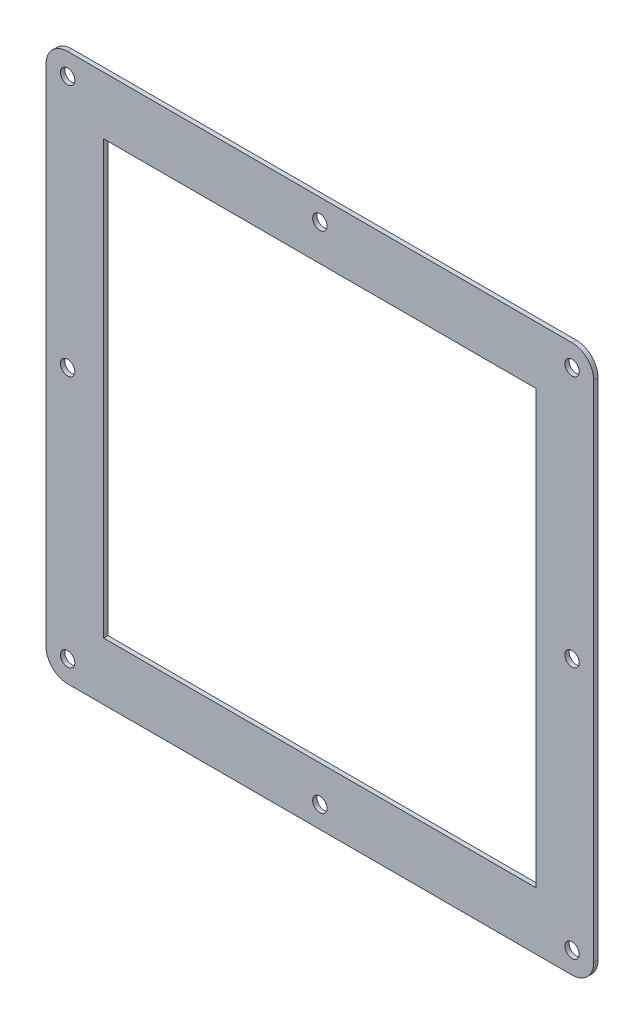
ISO-10303-21;
HEADER;
FILE_DESCRIPTION(('STEP AP214'),'2;1');
FILE_NAME('part.step','',(''),(''),'','','');
FILE_SCHEMA(('AUTOMOTIVE_DESIGN { 1 0 10303 214 1 1 1 1 }'));
ENDSEC;
DATA;
#1=APPLICATION_CONTEXT('core data for automotive mechanical design processes');
#2=APPLICATION_PROTOCOL_DEFINITION('international standard','automotive_design',2000,#1);
#3=PRODUCT_CONTEXT('',#1,'mechanical');
#4=PRODUCT('Part','Part','',(#3));
#5=PRODUCT_RELATED_PRODUCT_CATEGORY('part','',(#4));
#6=PRODUCT_DEFINITION_FORMATION('','',#4);
#7=PRODUCT_DEFINITION_CONTEXT('part definition',#1,'design');
#8=PRODUCT_DEFINITION('design','',#6,#7);
#9=PRODUCT_DEFINITION_SHAPE('','',#8);
#10=(LENGTH_UNIT() NAMED_UNIT(*) SI_UNIT(.MILLI.,.METRE.));
#11=(NAMED_UNIT(*) PLANE_ANGLE_UNIT() SI_UNIT($,.RADIAN.));
#12=(NAMED_UNIT(*) SI_UNIT($,.STERADIAN.) SOLID_ANGLE_UNIT());
#13=UNCERTAINTY_MEASURE_WITH_UNIT(LENGTH_MEASURE(1.E-05),#10,'distance_accuracy_value','');
#14=(GEOMETRIC_REPRESENTATION_CONTEXT(3) GLOBAL_UNCERTAINTY_ASSIGNED_CONTEXT((#13)) GLOBAL_UNIT_ASSIGNED_CONTEXT((#10,
#11,#12)) REPRESENTATION_CONTEXT('',''));
#15=CARTESIAN_POINT('',(0.,0.,0.));
#16=DIRECTION('',(0.,0.,1.));
#17=DIRECTION('',(1.,0.,0.));
#18=AXIS2_PLACEMENT_3D('',#15,#16,#17);
#19=CARTESIAN_POINT('',(-175.,-175.,3.));
#20=DIRECTION('',(0.,0.,1.));
#21=DIRECTION('',(1.,0.,0.));
#22=AXIS2_PLACEMENT_3D('',#19,#20,#21);
#23=PLANE('',#22);
#24=CARTESIAN_POINT('',(0.,-175.,3.));
#25=DIRECTION('',(0.,0.,1.));
#26=DIRECTION('',(1.,0.,0.));
#27=AXIS2_PLACEMENT_3D('',#24,#25,#26);
#28=CIRCLE('',#27,5.);
#29=CARTESIAN_POINT('',(5.,-175.,3.));
#30=VERTEX_POINT('',#29);
#31=EDGE_CURVE('E372',#30,#30,#28,.T.);
#32=ORIENTED_EDGE('',*,*,#31,.F.);
#33=EDGE_LOOP('',(#32));
#34=FACE_BOUND('',#33,.T.);
#35=DIRECTION('',(-1.,0.,0.));
#36=VECTOR('',#35,1.);
#37=CARTESIAN_POINT('',(-150.,150.,3.));
#38=LINE('',#37,#36);
#39=CARTESIAN_POINT('',(150.,150.,3.));
#40=VERTEX_POINT('',#39);
#41=CARTESIAN_POINT('',(-150.,150.,3.));
#42=VERTEX_POINT('',#41);
#43=EDGE_CURVE('E130',#40,#42,#38,.T.);
#44=ORIENTED_EDGE('',*,*,#43,.F.);
#45=DIRECTION('',(0.,1.,0.));
#46=VECTOR('',#45,1.);
#47=CARTESIAN_POINT('',(150.,150.,3.));
#48=LINE('',#47,#46);
#49=CARTESIAN_POINT('',(150.,-150.,3.));
#50=VERTEX_POINT('',#49);
#51=EDGE_CURVE('E122',#50,#40,#48,.T.);
#52=ORIENTED_EDGE('',*,*,#51,.F.);
#53=DIRECTION('',(1.,0.,0.));
#54=VECTOR('',#53,1.);
#55=CARTESIAN_POINT('',(-150.,-150.,3.));
#56=LINE('',#55,#54);
#57=CARTESIAN_POINT('',(-150.,-150.,3.));
#58=VERTEX_POINT('',#57);
#59=EDGE_CURVE('E145',#58,#50,#56,.T.);
#60=ORIENTED_EDGE('',*,*,#59,.F.);
#61=DIRECTION('',(0.,-1.,0.));
#62=VECTOR('',#61,1.);
#63=CARTESIAN_POINT('',(-150.,150.,3.));
#64=LINE('',#63,#62);
#65=EDGE_CURVE('E143',#42,#58,#64,.T.);
#66=ORIENTED_EDGE('',*,*,#65,.F.);
#67=EDGE_LOOP('',(#44,#52,#60,#66));
#68=FACE_BOUND('',#67,.T.);
#69=CARTESIAN_POINT('',(-175.,0.,3.));
#70=DIRECTION('',(0.,0.,1.));
#71=DIRECTION('',(1.,0.,0.));
#72=AXIS2_PLACEMENT_3D('',#69,#70,#71);
#73=CIRCLE('',#72,5.00000000000002);
#74=CARTESIAN_POINT('',(-170.,0.,3.));
#75=VERTEX_POINT('',#74);
#76=EDGE_CURVE('E161',#75,#75,#73,.T.);
#77=ORIENTED_EDGE('',*,*,#76,.F.);
#78=EDGE_LOOP('',(#77));
#79=FACE_BOUND('',#78,.T.);
#80=CARTESIAN_POINT('',(175.,175.,3.));
#81=DIRECTION('',(0.,0.,1.));
#82=DIRECTION('',(1.,0.,0.));
#83=AXIS2_PLACEMENT_3D('',#80,#81,#82);
#84=CIRCLE('',#83,4.99999999999999);
#85=CARTESIAN_POINT('',(180.,175.,3.));
#86=VERTEX_POINT('',#85);
#87=EDGE_CURVE('E173',#86,#86,#84,.T.);
#88=ORIENTED_EDGE('',*,*,#87,.F.);
#89=EDGE_LOOP('',(#88));
#90=FACE_BOUND('',#89,.T.);
#91=CARTESIAN_POINT('',(-175.,175.,3.));
#92=DIRECTION('',(0.,0.,1.));
#93=DIRECTION('',(1.,0.,0.));
#94=AXIS2_PLACEMENT_3D('',#91,#92,#93);
#95=CIRCLE('',#94,4.99999999999999);
#96=CARTESIAN_POINT('',(-170.,175.,3.));
#97=VERTEX_POINT('',#96);
#98=EDGE_CURVE('E185',#97,#97,#95,.T.);
#99=ORIENTED_EDGE('',*,*,#98,.F.);
#100=EDGE_LOOP('',(#99));
#101=FACE_BOUND('',#100,.T.);
#102=CARTESIAN_POINT('',(-175.,-175.,3.));
#103=DIRECTION('',(0.,0.,1.));
#104=DIRECTION('',(1.,0.,0.));
#105=AXIS2_PLACEMENT_3D('',#102,#103,#104);
#106=CIRCLE('',#105,15.);
#107=CARTESIAN_POINT('',(-190.,-175.,3.));
#108=VERTEX_POINT('',#107);
#109=CARTESIAN_POINT('',(-175.,-190.,3.));
#110=VERTEX_POINT('',#109);
#111=EDGE_CURVE('E191',#108,#110,#106,.T.);
#112=ORIENTED_EDGE('',*,*,#111,.T.);
#113=DIRECTION('',(1.,0.,0.));
#114=VECTOR('',#113,1.);
#115=CARTESIAN_POINT('',(-175.,-190.,3.));
#116=LINE('',#115,#114);
#117=CARTESIAN_POINT('',(175.,-190.,3.));
#118=VERTEX_POINT('',#117);
#119=EDGE_CURVE('E194',#110,#118,#116,.T.);
#120=ORIENTED_EDGE('',*,*,#119,.T.);
#121=CARTESIAN_POINT('',(175.,-175.,3.));
#122=DIRECTION('',(0.,0.,1.));
#123=DIRECTION('',(1.,0.,0.));
#124=AXIS2_PLACEMENT_3D('',#121,#122,#123);
#125=CIRCLE('',#124,15.);
#126=CARTESIAN_POINT('',(190.,-175.,3.));
#127=VERTEX_POINT('',#126);
#128=EDGE_CURVE('E197',#118,#127,#125,.T.);
#129=ORIENTED_EDGE('',*,*,#128,.T.);
#130=DIRECTION('',(0.,1.,0.));
#131=VECTOR('',#130,1.);
#132=CARTESIAN_POINT('',(190.,175.,3.));
#133=LINE('',#132,#131);
#134=CARTESIAN_POINT('',(190.,175.,3.));
#135=VERTEX_POINT('',#134);
#136=EDGE_CURVE('E199',#127,#135,#133,.T.);
#137=ORIENTED_EDGE('',*,*,#136,.T.);
#138=CARTESIAN_POINT('',(175.,175.,3.));
#139=DIRECTION('',(0.,0.,1.));
#140=DIRECTION('',(-1.,0.,0.));
#141=AXIS2_PLACEMENT_3D('',#138,#139,#140);
#142=CIRCLE('',#141,15.);
#143=CARTESIAN_POINT('',(175.,190.,3.));
#144=VERTEX_POINT('',#143);
#145=EDGE_CURVE('E201',#135,#144,#142,.T.);
#146=ORIENTED_EDGE('',*,*,#145,.T.);
#147=DIRECTION('',(-1.,0.,0.));
#148=VECTOR('',#147,1.);
#149=CARTESIAN_POINT('',(-175.,190.,3.));
#150=LINE('',#149,#148);
#151=CARTESIAN_POINT('',(-175.,190.,3.));
#152=VERTEX_POINT('',#151);
#153=EDGE_CURVE('E203',#144,#152,#150,.T.);
#154=ORIENTED_EDGE('',*,*,#153,.T.);
#155=CARTESIAN_POINT('',(-175.,175.,3.));
#156=DIRECTION('',(0.,0.,1.));
#157=DIRECTION('',(1.,0.,0.));
#158=AXIS2_PLACEMENT_3D('',#155,#156,#157);
#159=CIRCLE('',#158,15.0000000000001);
#160=CARTESIAN_POINT('',(-190.,175.,3.));
#161=VERTEX_POINT('',#160);
#162=EDGE_CURVE('E205',#152,#161,#159,.T.);
#163=ORIENTED_EDGE('',*,*,#162,.T.);
#164=DIRECTION('',(0.,-1.,0.));
#165=VECTOR('',#164,1.);
#166=CARTESIAN_POINT('',(-190.,175.,3.));
#167=LINE('',#166,#165);
#168=EDGE_CURVE('E207',#161,#108,#167,.T.);
#169=ORIENTED_EDGE('',*,*,#168,.T.);
#170=EDGE_LOOP('',(#112,#120,#129,#137,#146,#154,#163,#169));
#171=FACE_BOUND('',#170,.T.);
#172=CARTESIAN_POINT('',(0.,175.,3.));
#173=DIRECTION('',(0.,0.,1.));
#174=DIRECTION('',(1.,0.,0.));
#175=AXIS2_PLACEMENT_3D('',#172,#173,#174);
#176=CIRCLE('',#175,5.00000000000001);
#177=CARTESIAN_POINT('',(5.00000000000001,175.,3.));
#178=VERTEX_POINT('',#177);
#179=EDGE_CURVE('E179',#178,#178,#176,.T.);
#180=ORIENTED_EDGE('',*,*,#179,.F.);
#181=EDGE_LOOP('',(#180));
#182=FACE_BOUND('',#181,.T.);
#183=CARTESIAN_POINT('',(175.,0.,3.));
#184=DIRECTION('',(0.,0.,1.));
#185=DIRECTION('',(1.,0.,0.));
#186=AXIS2_PLACEMENT_3D('',#183,#184,#185);
#187=CIRCLE('',#186,5.00000000000002);
#188=CARTESIAN_POINT('',(180.,0.,3.));
#189=VERTEX_POINT('',#188);
#190=EDGE_CURVE('E167',#189,#189,#187,.T.);
#191=ORIENTED_EDGE('',*,*,#190,.F.);
#192=EDGE_LOOP('',(#191));
#193=FACE_BOUND('',#192,.T.);
#194=CARTESIAN_POINT('',(-175.,-175.,3.));
#195=DIRECTION('',(0.,0.,1.));
#196=DIRECTION('',(1.,0.,0.));
#197=AXIS2_PLACEMENT_3D('',#194,#195,#196);
#198=CIRCLE('',#197,4.99999999999999);
#199=CARTESIAN_POINT('',(-170.,-175.,3.));
#200=VERTEX_POINT('',#199);
#201=EDGE_CURVE('E151',#200,#200,#198,.T.);
#202=ORIENTED_EDGE('',*,*,#201,.F.);
#203=EDGE_LOOP('',(#202));
#204=FACE_BOUND('',#203,.T.);
#205=CARTESIAN_POINT('',(175.,-175.,3.));
#206=DIRECTION('',(0.,0.,1.));
#207=DIRECTION('',(1.,0.,0.));
#208=AXIS2_PLACEMENT_3D('',#205,#206,#207);
#209=CIRCLE('',#208,4.99999999999999);
#210=CARTESIAN_POINT('',(180.,-175.,3.));
#211=VERTEX_POINT('',#210);
#212=EDGE_CURVE('E363',#211,#211,#209,.T.);
#213=ORIENTED_EDGE('',*,*,#212,.F.);
#214=EDGE_LOOP('',(#213));
#215=FACE_BOUND('',#214,.T.);
#216=ADVANCED_FACE('F33',(#34,#68,#79,#90,#101,#171,#182,#193,#204,#215),#23,.T.);
#217=CARTESIAN_POINT('',(-175.,-175.,0.));
#218=DIRECTION('',(0.,0.,1.));
#219=DIRECTION('',(1.,0.,0.));
#220=AXIS2_PLACEMENT_3D('',#217,#218,#219);
#221=PLANE('',#220);
#222=CARTESIAN_POINT('',(-175.,0.,0.));
#223=DIRECTION('',(0.,0.,1.));
#224=DIRECTION('',(1.,0.,0.));
#225=AXIS2_PLACEMENT_3D('',#222,#223,#224);
#226=CIRCLE('',#225,5.00000000000002);
#227=CARTESIAN_POINT('',(-170.,0.,0.));
#228=VERTEX_POINT('',#227);
#229=EDGE_CURVE('E138',#228,#228,#226,.T.);
#230=ORIENTED_EDGE('',*,*,#229,.T.);
#231=EDGE_LOOP('',(#230));
#232=FACE_BOUND('',#231,.T.);
#233=CARTESIAN_POINT('',(175.,0.,0.));
#234=DIRECTION('',(0.,0.,1.));
#235=DIRECTION('',(1.,0.,0.));
#236=AXIS2_PLACEMENT_3D('',#233,#234,#235);
#237=CIRCLE('',#236,5.00000000000002);
#238=CARTESIAN_POINT('',(180.,0.,0.));
#239=VERTEX_POINT('',#238);
#240=EDGE_CURVE('E164',#239,#239,#237,.T.);
#241=ORIENTED_EDGE('',*,*,#240,.T.);
#242=EDGE_LOOP('',(#241));
#243=FACE_BOUND('',#242,.T.);
#244=CARTESIAN_POINT('',(175.,175.,0.));
#245=DIRECTION('',(0.,0.,1.));
#246=DIRECTION('',(1.,0.,0.));
#247=AXIS2_PLACEMENT_3D('',#244,#245,#246);
#248=CIRCLE('',#247,4.99999999999999);
#249=CARTESIAN_POINT('',(180.,175.,0.));
#250=VERTEX_POINT('',#249);
#251=EDGE_CURVE('E170',#250,#250,#248,.T.);
#252=ORIENTED_EDGE('',*,*,#251,.T.);
#253=EDGE_LOOP('',(#252));
#254=FACE_BOUND('',#253,.T.);
#255=CARTESIAN_POINT('',(0.,175.,0.));
#256=DIRECTION('',(0.,0.,1.));
#257=DIRECTION('',(1.,0.,0.));
#258=AXIS2_PLACEMENT_3D('',#255,#256,#257);
#259=CIRCLE('',#258,5.00000000000001);
#260=CARTESIAN_POINT('',(5.00000000000001,175.,0.));
#261=VERTEX_POINT('',#260);
#262=EDGE_CURVE('E176',#261,#261,#259,.T.);
#263=ORIENTED_EDGE('',*,*,#262,.T.);
#264=EDGE_LOOP('',(#263));
#265=FACE_BOUND('',#264,.T.);
#266=CARTESIAN_POINT('',(-175.,175.,0.));
#267=DIRECTION('',(0.,0.,1.));
#268=DIRECTION('',(1.,0.,0.));
#269=AXIS2_PLACEMENT_3D('',#266,#267,#268);
#270=CIRCLE('',#269,4.99999999999999);
#271=CARTESIAN_POINT('',(-170.,175.,0.));
#272=VERTEX_POINT('',#271);
#273=EDGE_CURVE('E182',#272,#272,#270,.T.);
#274=ORIENTED_EDGE('',*,*,#273,.T.);
#275=EDGE_LOOP('',(#274));
#276=FACE_BOUND('',#275,.T.);
#277=CARTESIAN_POINT('',(-175.,-175.,0.));
#278=DIRECTION('',(0.,0.,1.));
#279=DIRECTION('',(1.,0.,0.));
#280=AXIS2_PLACEMENT_3D('',#277,#278,#279);
#281=CIRCLE('',#280,15.);
#282=CARTESIAN_POINT('',(-190.,-175.,0.));
#283=VERTEX_POINT('',#282);
#284=CARTESIAN_POINT('',(-175.,-190.,0.));
#285=VERTEX_POINT('',#284);
#286=EDGE_CURVE('E188',#283,#285,#281,.T.);
#287=ORIENTED_EDGE('',*,*,#286,.F.);
#288=DIRECTION('',(0.,-1.,0.));
#289=VECTOR('',#288,1.);
#290=CARTESIAN_POINT('',(-190.,175.,0.));
#291=LINE('',#290,#289);
#292=CARTESIAN_POINT('',(-190.,175.,0.));
#293=VERTEX_POINT('',#292);
#294=EDGE_CURVE('E195',#293,#283,#291,.T.);
#295=ORIENTED_EDGE('',*,*,#294,.F.);
#296=CARTESIAN_POINT('',(-175.,175.,0.));
#297=DIRECTION('',(0.,0.,1.));
#298=DIRECTION('',(1.,0.,0.));
#299=AXIS2_PLACEMENT_3D('',#296,#297,#298);
#300=CIRCLE('',#299,15.0000000000001);
#301=CARTESIAN_POINT('',(-175.,190.,0.));
#302=VERTEX_POINT('',#301);
#303=EDGE_CURVE('E222',#302,#293,#300,.T.);
#304=ORIENTED_EDGE('',*,*,#303,.F.);
#305=DIRECTION('',(-1.,0.,0.));
#306=VECTOR('',#305,1.);
#307=CARTESIAN_POINT('',(-175.,190.,0.));
#308=LINE('',#307,#306);
#309=CARTESIAN_POINT('',(175.,190.,0.));
#310=VERTEX_POINT('',#309);
#311=EDGE_CURVE('E220',#310,#302,#308,.T.);
#312=ORIENTED_EDGE('',*,*,#311,.F.);
#313=CARTESIAN_POINT('',(175.,175.,0.));
#314=DIRECTION('',(0.,0.,1.));
#315=DIRECTION('',(-1.,0.,0.));
#316=AXIS2_PLACEMENT_3D('',#313,#314,#315);
#317=CIRCLE('',#316,15.);
#318=CARTESIAN_POINT('',(190.,175.,0.));
#319=VERTEX_POINT('',#318);
#320=EDGE_CURVE('E218',#319,#310,#317,.T.);
#321=ORIENTED_EDGE('',*,*,#320,.F.);
#322=DIRECTION('',(0.,1.,0.));
#323=VECTOR('',#322,1.);
#324=CARTESIAN_POINT('',(190.,175.,0.));
#325=LINE('',#324,#323);
#326=CARTESIAN_POINT('',(190.,-175.,0.));
#327=VERTEX_POINT('',#326);
#328=EDGE_CURVE('E216',#327,#319,#325,.T.);
#329=ORIENTED_EDGE('',*,*,#328,.F.);
#330=CARTESIAN_POINT('',(175.,-175.,0.));
#331=DIRECTION('',(0.,0.,1.));
#332=DIRECTION('',(1.,0.,0.));
#333=AXIS2_PLACEMENT_3D('',#330,#331,#332);
#334=CIRCLE('',#333,15.);
#335=CARTESIAN_POINT('',(175.,-190.,0.));
#336=VERTEX_POINT('',#335);
#337=EDGE_CURVE('E214',#336,#327,#334,.T.);
#338=ORIENTED_EDGE('',*,*,#337,.F.);
#339=DIRECTION('',(1.,0.,0.));
#340=VECTOR('',#339,1.);
#341=CARTESIAN_POINT('',(-175.,-190.,0.));
#342=LINE('',#341,#340);
#343=EDGE_CURVE('E212',#285,#336,#342,.T.);
#344=ORIENTED_EDGE('',*,*,#343,.F.);
#345=EDGE_LOOP('',(#287,#295,#304,#312,#321,#329,#338,#344));
#346=FACE_BOUND('',#345,.T.);
#347=DIRECTION('',(0.,1.,0.));
#348=VECTOR('',#347,1.);
#349=CARTESIAN_POINT('',(150.,150.,0.));
#350=LINE('',#349,#348);
#351=CARTESIAN_POINT('',(150.,-150.,0.));
#352=VERTEX_POINT('',#351);
#353=CARTESIAN_POINT('',(150.,150.,0.));
#354=VERTEX_POINT('',#353);
#355=EDGE_CURVE('E56',#352,#354,#350,.T.);
#356=ORIENTED_EDGE('',*,*,#355,.T.);
#357=DIRECTION('',(-1.,0.,0.));
#358=VECTOR('',#357,1.);
#359=CARTESIAN_POINT('',(-150.,150.,0.));
#360=LINE('',#359,#358);
#361=CARTESIAN_POINT('',(-150.,150.,0.));
#362=VERTEX_POINT('',#361);
#363=EDGE_CURVE('E137',#354,#362,#360,.T.);
#364=ORIENTED_EDGE('',*,*,#363,.T.);
#365=DIRECTION('',(0.,-1.,0.));
#366=VECTOR('',#365,1.);
#367=CARTESIAN_POINT('',(-150.,150.,0.));
#368=LINE('',#367,#366);
#369=CARTESIAN_POINT('',(-150.,-150.,0.));
#370=VERTEX_POINT('',#369);
#371=EDGE_CURVE('E153',#362,#370,#368,.T.);
#372=ORIENTED_EDGE('',*,*,#371,.T.);
#373=DIRECTION('',(1.,0.,0.));
#374=VECTOR('',#373,1.);
#375=CARTESIAN_POINT('',(-150.,-150.,0.));
#376=LINE('',#375,#374);
#377=EDGE_CURVE('E131',#370,#352,#376,.T.);
#378=ORIENTED_EDGE('',*,*,#377,.T.);
#379=EDGE_LOOP('',(#356,#364,#372,#378));
#380=FACE_BOUND('',#379,.T.);
#381=CARTESIAN_POINT('',(-175.,-175.,0.));
#382=DIRECTION('',(0.,0.,1.));
#383=DIRECTION('',(1.,0.,0.));
#384=AXIS2_PLACEMENT_3D('',#381,#382,#383);
#385=CIRCLE('',#384,4.99999999999999);
#386=CARTESIAN_POINT('',(-170.,-175.,0.));
#387=VERTEX_POINT('',#386);
#388=EDGE_CURVE('E375',#387,#387,#385,.T.);
#389=ORIENTED_EDGE('',*,*,#388,.T.);
#390=EDGE_LOOP('',(#389));
#391=FACE_BOUND('',#390,.T.);
#392=CARTESIAN_POINT('',(0.,-175.,0.));
#393=DIRECTION('',(0.,0.,1.));
#394=DIRECTION('',(1.,0.,0.));
#395=AXIS2_PLACEMENT_3D('',#392,#393,#394);
#396=CIRCLE('',#395,5.);
#397=CARTESIAN_POINT('',(5.,-175.,0.));
#398=VERTEX_POINT('',#397);
#399=EDGE_CURVE('E369',#398,#398,#396,.T.);
#400=ORIENTED_EDGE('',*,*,#399,.T.);
#401=EDGE_LOOP('',(#400));
#402=FACE_BOUND('',#401,.T.);
#403=CARTESIAN_POINT('',(175.,-175.,0.));
#404=DIRECTION('',(0.,0.,1.));
#405=DIRECTION('',(1.,0.,0.));
#406=AXIS2_PLACEMENT_3D('',#403,#404,#405);
#407=CIRCLE('',#406,4.99999999999999);
#408=CARTESIAN_POINT('',(180.,-175.,0.));
#409=VERTEX_POINT('',#408);
#410=EDGE_CURVE('E366',#409,#409,#407,.T.);
#411=ORIENTED_EDGE('',*,*,#410,.T.);
#412=EDGE_LOOP('',(#411));
#413=FACE_BOUND('',#412,.T.);
#414=ADVANCED_FACE('F252',(#232,#243,#254,#265,#276,#346,#380,#391,#402,#413),#221,.F.);
#415=CARTESIAN_POINT('',(-175.,-175.,3.));
#416=DIRECTION('',(0.,0.,-1.));
#417=DIRECTION('',(-1.,0.,0.));
#418=AXIS2_PLACEMENT_3D('',#415,#416,#417);
#419=CYLINDRICAL_SURFACE('',#418,15.);
#420=ORIENTED_EDGE('',*,*,#286,.T.);
#421=DIRECTION('',(0.,0.,-1.));
#422=VECTOR('',#421,1.);
#423=CARTESIAN_POINT('',(-175.,-190.,3.));
#424=LINE('',#423,#422);
#425=EDGE_CURVE('E11',#110,#285,#424,.T.);
#426=ORIENTED_EDGE('',*,*,#425,.F.);
#427=ORIENTED_EDGE('',*,*,#111,.F.);
#428=DIRECTION('',(0.,0.,-1.));
#429=VECTOR('',#428,1.);
#430=CARTESIAN_POINT('',(-190.,-175.,3.));
#431=LINE('',#430,#429);
#432=EDGE_CURVE('E209',#108,#283,#431,.T.);
#433=ORIENTED_EDGE('',*,*,#432,.T.);
#434=EDGE_LOOP('',(#420,#426,#427,#433));
#435=FACE_BOUND('',#434,.T.);
#436=ADVANCED_FACE('F35',(#435),#419,.T.);
#437=CARTESIAN_POINT('',(-175.,-190.,3.));
#438=DIRECTION('',(0.,1.,0.));
#439=DIRECTION('',(0.,0.,1.));
#440=AXIS2_PLACEMENT_3D('',#437,#438,#439);
#441=PLANE('',#440);
#442=ORIENTED_EDGE('',*,*,#343,.T.);
#443=DIRECTION('',(0.,0.,-1.));
#444=VECTOR('',#443,1.);
#445=CARTESIAN_POINT('',(175.,-190.,3.));
#446=LINE('',#445,#444);
#447=EDGE_CURVE('E41',#118,#336,#446,.T.);
#448=ORIENTED_EDGE('',*,*,#447,.F.);
#449=ORIENTED_EDGE('',*,*,#119,.F.);
#450=ORIENTED_EDGE('',*,*,#425,.T.);
#451=EDGE_LOOP('',(#442,#448,#449,#450));
#452=FACE_BOUND('',#451,.T.);
#453=ADVANCED_FACE('F270',(#452),#441,.F.);
#454=CARTESIAN_POINT('',(175.,-175.,3.));
#455=DIRECTION('',(0.,0.,-1.));
#456=DIRECTION('',(-1.,0.,0.));
#457=AXIS2_PLACEMENT_3D('',#454,#455,#456);
#458=CYLINDRICAL_SURFACE('',#457,15.);
#459=ORIENTED_EDGE('',*,*,#337,.T.);
#460=DIRECTION('',(0.,0.,-1.));
#461=VECTOR('',#460,1.);
#462=CARTESIAN_POINT('',(190.,-175.,3.));
#463=LINE('',#462,#461);
#464=EDGE_CURVE('E239',#127,#327,#463,.T.);
#465=ORIENTED_EDGE('',*,*,#464,.F.);
#466=ORIENTED_EDGE('',*,*,#128,.F.);
#467=ORIENTED_EDGE('',*,*,#447,.T.);
#468=EDGE_LOOP('',(#459,#465,#466,#467));
#469=FACE_BOUND('',#468,.T.);
#470=ADVANCED_FACE('F246',(#469),#458,.T.);
#471=CARTESIAN_POINT('',(190.,175.,3.));
#472=DIRECTION('',(-1.,0.,0.));
#473=DIRECTION('',(0.,-1.,0.));
#474=AXIS2_PLACEMENT_3D('',#471,#472,#473);
#475=PLANE('',#474);
#476=ORIENTED_EDGE('',*,*,#328,.T.);
#477=DIRECTION('',(0.,0.,-1.));
#478=VECTOR('',#477,1.);
#479=CARTESIAN_POINT('',(190.,175.,3.));
#480=LINE('',#479,#478);
#481=EDGE_CURVE('E236',#135,#319,#480,.T.);
#482=ORIENTED_EDGE('',*,*,#481,.F.);
#483=ORIENTED_EDGE('',*,*,#136,.F.);
#484=ORIENTED_EDGE('',*,*,#464,.T.);
#485=EDGE_LOOP('',(#476,#482,#483,#484));
#486=FACE_BOUND('',#485,.T.);
#487=ADVANCED_FACE('F258',(#486),#475,.F.);
#488=CARTESIAN_POINT('',(175.,175.,3.));
#489=DIRECTION('',(0.,0.,-1.));
#490=DIRECTION('',(-1.,0.,0.));
#491=AXIS2_PLACEMENT_3D('',#488,#489,#490);
#492=CYLINDRICAL_SURFACE('',#491,15.);
#493=ORIENTED_EDGE('',*,*,#320,.T.);
#494=DIRECTION('',(0.,0.,-1.));
#495=VECTOR('',#494,1.);
#496=CARTESIAN_POINT('',(175.,190.,3.));
#497=LINE('',#496,#495);
#498=EDGE_CURVE('E233',#144,#310,#497,.T.);
#499=ORIENTED_EDGE('',*,*,#498,.F.);
#500=ORIENTED_EDGE('',*,*,#145,.F.);
#501=ORIENTED_EDGE('',*,*,#481,.T.);
#502=EDGE_LOOP('',(#493,#499,#500,#501));
#503=FACE_BOUND('',#502,.T.);
#504=ADVANCED_FACE('F262',(#503),#492,.T.);
#505=CARTESIAN_POINT('',(-175.,190.,3.));
#506=DIRECTION('',(0.,-1.,0.));
#507=DIRECTION('',(0.,0.,-1.));
#508=AXIS2_PLACEMENT_3D('',#505,#506,#507);
#509=PLANE('',#508);
#510=ORIENTED_EDGE('',*,*,#311,.T.);
#511=DIRECTION('',(0.,0.,-1.));
#512=VECTOR('',#511,1.);
#513=CARTESIAN_POINT('',(-175.,190.,3.));
#514=LINE('',#513,#512);
#515=EDGE_CURVE('E230',#152,#302,#514,.T.);
#516=ORIENTED_EDGE('',*,*,#515,.F.);
#517=ORIENTED_EDGE('',*,*,#153,.F.);
#518=ORIENTED_EDGE('',*,*,#498,.T.);
#519=EDGE_LOOP('',(#510,#516,#517,#518));
#520=FACE_BOUND('',#519,.T.);
#521=ADVANCED_FACE('F283',(#520),#509,.F.);
#522=CARTESIAN_POINT('',(-175.,175.,3.));
#523=DIRECTION('',(0.,0.,-1.));
#524=DIRECTION('',(-1.,0.,0.));
#525=AXIS2_PLACEMENT_3D('',#522,#523,#524);
#526=CYLINDRICAL_SURFACE('',#525,15.0000000000001);
#527=ORIENTED_EDGE('',*,*,#303,.T.);
#528=DIRECTION('',(0.,0.,-1.));
#529=VECTOR('',#528,1.);
#530=CARTESIAN_POINT('',(-190.,175.,3.));
#531=LINE('',#530,#529);
#532=EDGE_CURVE('E227',#161,#293,#531,.T.);
#533=ORIENTED_EDGE('',*,*,#532,.F.);
#534=ORIENTED_EDGE('',*,*,#162,.F.);
#535=ORIENTED_EDGE('',*,*,#515,.T.);
#536=EDGE_LOOP('',(#527,#533,#534,#535));
#537=FACE_BOUND('',#536,.T.);
#538=ADVANCED_FACE('F281',(#537),#526,.T.);
#539=CARTESIAN_POINT('',(-190.,175.,3.));
#540=DIRECTION('',(1.,0.,0.));
#541=DIRECTION('',(0.,1.,0.));
#542=AXIS2_PLACEMENT_3D('',#539,#540,#541);
#543=PLANE('',#542);
#544=ORIENTED_EDGE('',*,*,#294,.T.);
#545=ORIENTED_EDGE('',*,*,#432,.F.);
#546=ORIENTED_EDGE('',*,*,#168,.F.);
#547=ORIENTED_EDGE('',*,*,#532,.T.);
#548=EDGE_LOOP('',(#544,#545,#546,#547));
#549=FACE_BOUND('',#548,.T.);
#550=ADVANCED_FACE('F276',(#549),#543,.F.);
#551=CARTESIAN_POINT('',(-175.,175.,3.));
#552=DIRECTION('',(0.,0.,-1.));
#553=DIRECTION('',(-1.,0.,0.));
#554=AXIS2_PLACEMENT_3D('',#551,#552,#553);
#555=CYLINDRICAL_SURFACE('',#554,4.99999999999999);
#556=ORIENTED_EDGE('',*,*,#98,.T.);
#557=EDGE_LOOP('',(#556));
#558=FACE_BOUND('',#557,.T.);
#559=ORIENTED_EDGE('',*,*,#273,.F.);
#560=EDGE_LOOP('',(#559));
#561=FACE_BOUND('',#560,.T.);
#562=ADVANCED_FACE('F302',(#558,#561),#555,.F.);
#563=CARTESIAN_POINT('',(0.,175.,3.));
#564=DIRECTION('',(0.,0.,-1.));
#565=DIRECTION('',(-1.,0.,0.));
#566=AXIS2_PLACEMENT_3D('',#563,#564,#565);
#567=CYLINDRICAL_SURFACE('',#566,5.00000000000001);
#568=ORIENTED_EDGE('',*,*,#179,.T.);
#569=EDGE_LOOP('',(#568));
#570=FACE_BOUND('',#569,.T.);
#571=ORIENTED_EDGE('',*,*,#262,.F.);
#572=EDGE_LOOP('',(#571));
#573=FACE_BOUND('',#572,.T.);
#574=ADVANCED_FACE('F309',(#570,#573),#567,.F.);
#575=CARTESIAN_POINT('',(175.,175.,3.));
#576=DIRECTION('',(0.,0.,-1.));
#577=DIRECTION('',(-1.,0.,0.));
#578=AXIS2_PLACEMENT_3D('',#575,#576,#577);
#579=CYLINDRICAL_SURFACE('',#578,4.99999999999999);
#580=ORIENTED_EDGE('',*,*,#87,.T.);
#581=EDGE_LOOP('',(#580));
#582=FACE_BOUND('',#581,.T.);
#583=ORIENTED_EDGE('',*,*,#251,.F.);
#584=EDGE_LOOP('',(#583));
#585=FACE_BOUND('',#584,.T.);
#586=ADVANCED_FACE('F314',(#582,#585),#579,.F.);
#587=CARTESIAN_POINT('',(175.,0.,3.));
#588=DIRECTION('',(0.,0.,-1.));
#589=DIRECTION('',(-1.,0.,0.));
#590=AXIS2_PLACEMENT_3D('',#587,#588,#589);
#591=CYLINDRICAL_SURFACE('',#590,5.00000000000002);
#592=ORIENTED_EDGE('',*,*,#190,.T.);
#593=EDGE_LOOP('',(#592));
#594=FACE_BOUND('',#593,.T.);
#595=ORIENTED_EDGE('',*,*,#240,.F.);
#596=EDGE_LOOP('',(#595));
#597=FACE_BOUND('',#596,.T.);
#598=ADVANCED_FACE('F324',(#594,#597),#591,.F.);
#599=CARTESIAN_POINT('',(-175.,0.,3.));
#600=DIRECTION('',(0.,0.,-1.));
#601=DIRECTION('',(-1.,0.,0.));
#602=AXIS2_PLACEMENT_3D('',#599,#600,#601);
#603=CYLINDRICAL_SURFACE('',#602,5.00000000000002);
#604=ORIENTED_EDGE('',*,*,#76,.T.);
#605=EDGE_LOOP('',(#604));
#606=FACE_BOUND('',#605,.T.);
#607=ORIENTED_EDGE('',*,*,#229,.F.);
#608=EDGE_LOOP('',(#607));
#609=FACE_BOUND('',#608,.T.);
#610=ADVANCED_FACE('F331',(#606,#609),#603,.F.);
#611=CARTESIAN_POINT('',(150.,150.,3.));
#612=DIRECTION('',(-1.,0.,0.));
#613=DIRECTION('',(0.,-1.,0.));
#614=AXIS2_PLACEMENT_3D('',#611,#612,#613);
#615=PLANE('',#614);
#616=ORIENTED_EDGE('',*,*,#355,.F.);
#617=DIRECTION('',(0.,0.,-1.));
#618=VECTOR('',#617,1.);
#619=CARTESIAN_POINT('',(150.,-150.,3.));
#620=LINE('',#619,#618);
#621=EDGE_CURVE('E126',#50,#352,#620,.T.);
#622=ORIENTED_EDGE('',*,*,#621,.F.);
#623=ORIENTED_EDGE('',*,*,#51,.T.);
#624=DIRECTION('',(0.,0.,-1.));
#625=VECTOR('',#624,1.);
#626=CARTESIAN_POINT('',(150.,150.,3.));
#627=LINE('',#626,#625);
#628=EDGE_CURVE('E125',#40,#354,#627,.T.);
#629=ORIENTED_EDGE('',*,*,#628,.T.);
#630=EDGE_LOOP('',(#616,#622,#623,#629));
#631=FACE_BOUND('',#630,.T.);
#632=ADVANCED_FACE('F124',(#631),#615,.T.);
#633=CARTESIAN_POINT('',(-150.,150.,3.));
#634=DIRECTION('',(0.,-1.,0.));
#635=DIRECTION('',(0.,0.,-1.));
#636=AXIS2_PLACEMENT_3D('',#633,#634,#635);
#637=PLANE('',#636);
#638=ORIENTED_EDGE('',*,*,#363,.F.);
#639=ORIENTED_EDGE('',*,*,#628,.F.);
#640=ORIENTED_EDGE('',*,*,#43,.T.);
#641=DIRECTION('',(0.,0.,-1.));
#642=VECTOR('',#641,1.);
#643=CARTESIAN_POINT('',(-150.,150.,3.));
#644=LINE('',#643,#642);
#645=EDGE_CURVE('E139',#42,#362,#644,.T.);
#646=ORIENTED_EDGE('',*,*,#645,.T.);
#647=EDGE_LOOP('',(#638,#639,#640,#646));
#648=FACE_BOUND('',#647,.T.);
#649=ADVANCED_FACE('F134',(#648),#637,.T.);
#650=CARTESIAN_POINT('',(-150.,150.,3.));
#651=DIRECTION('',(1.,0.,0.));
#652=DIRECTION('',(0.,0.,-1.));
#653=AXIS2_PLACEMENT_3D('',#650,#651,#652);
#654=PLANE('',#653);
#655=ORIENTED_EDGE('',*,*,#371,.F.);
#656=ORIENTED_EDGE('',*,*,#645,.F.);
#657=ORIENTED_EDGE('',*,*,#65,.T.);
#658=DIRECTION('',(0.,0.,-1.));
#659=VECTOR('',#658,1.);
#660=CARTESIAN_POINT('',(-150.,-150.,3.));
#661=LINE('',#660,#659);
#662=EDGE_CURVE('E48',#58,#370,#661,.T.);
#663=ORIENTED_EDGE('',*,*,#662,.T.);
#664=EDGE_LOOP('',(#655,#656,#657,#663));
#665=FACE_BOUND('',#664,.T.);
#666=ADVANCED_FACE('F340',(#665),#654,.T.);
#667=CARTESIAN_POINT('',(-150.,-150.,3.));
#668=DIRECTION('',(0.,1.,0.));
#669=DIRECTION('',(0.,0.,1.));
#670=AXIS2_PLACEMENT_3D('',#667,#668,#669);
#671=PLANE('',#670);
#672=ORIENTED_EDGE('',*,*,#377,.F.);
#673=ORIENTED_EDGE('',*,*,#662,.F.);
#674=ORIENTED_EDGE('',*,*,#59,.T.);
#675=ORIENTED_EDGE('',*,*,#621,.T.);
#676=EDGE_LOOP('',(#672,#673,#674,#675));
#677=FACE_BOUND('',#676,.T.);
#678=ADVANCED_FACE('F343',(#677),#671,.T.);
#679=CARTESIAN_POINT('',(-175.,-175.,3.));
#680=DIRECTION('',(0.,0.,-1.));
#681=DIRECTION('',(-1.,0.,0.));
#682=AXIS2_PLACEMENT_3D('',#679,#680,#681);
#683=CYLINDRICAL_SURFACE('',#682,4.99999999999999);
#684=ORIENTED_EDGE('',*,*,#201,.T.);
#685=EDGE_LOOP('',(#684));
#686=FACE_BOUND('',#685,.T.);
#687=ORIENTED_EDGE('',*,*,#388,.F.);
#688=EDGE_LOOP('',(#687));
#689=FACE_BOUND('',#688,.T.);
#690=ADVANCED_FACE('F347',(#686,#689),#683,.F.);
#691=CARTESIAN_POINT('',(0.,-175.,3.));
#692=DIRECTION('',(0.,0.,-1.));
#693=DIRECTION('',(-1.,0.,0.));
#694=AXIS2_PLACEMENT_3D('',#691,#692,#693);
#695=CYLINDRICAL_SURFACE('',#694,5.);
#696=ORIENTED_EDGE('',*,*,#31,.T.);
#697=EDGE_LOOP('',(#696));
#698=FACE_BOUND('',#697,.T.);
#699=ORIENTED_EDGE('',*,*,#399,.F.);
#700=EDGE_LOOP('',(#699));
#701=FACE_BOUND('',#700,.T.);
#702=ADVANCED_FACE('F350',(#698,#701),#695,.F.);
#703=CARTESIAN_POINT('',(175.,-175.,3.));
#704=DIRECTION('',(0.,0.,-1.));
#705=DIRECTION('',(-1.,0.,0.));
#706=AXIS2_PLACEMENT_3D('',#703,#704,#705);
#707=CYLINDRICAL_SURFACE('',#706,4.99999999999999);
#708=ORIENTED_EDGE('',*,*,#212,.T.);
#709=EDGE_LOOP('',(#708));
#710=FACE_BOUND('',#709,.T.);
#711=ORIENTED_EDGE('',*,*,#410,.F.);
#712=EDGE_LOOP('',(#711));
#713=FACE_BOUND('',#712,.T.);
#714=ADVANCED_FACE('F354',(#710,#713),#707,.F.);
#715=CLOSED_SHELL('',(#216,#414,#436,#453,#470,#487,#504,#521,#538,#550,#562,#574,#586,#598,
#610,#632,#649,#666,#678,#690,#702,#714));
#716=MANIFOLD_SOLID_BREP('B2',#715);
#717=ADVANCED_BREP_SHAPE_REPRESENTATION('',(#18,#716),#14);
#718=SHAPE_DEFINITION_REPRESENTATION(#9,#717);
ENDSEC;
END-ISO-10303-21;
